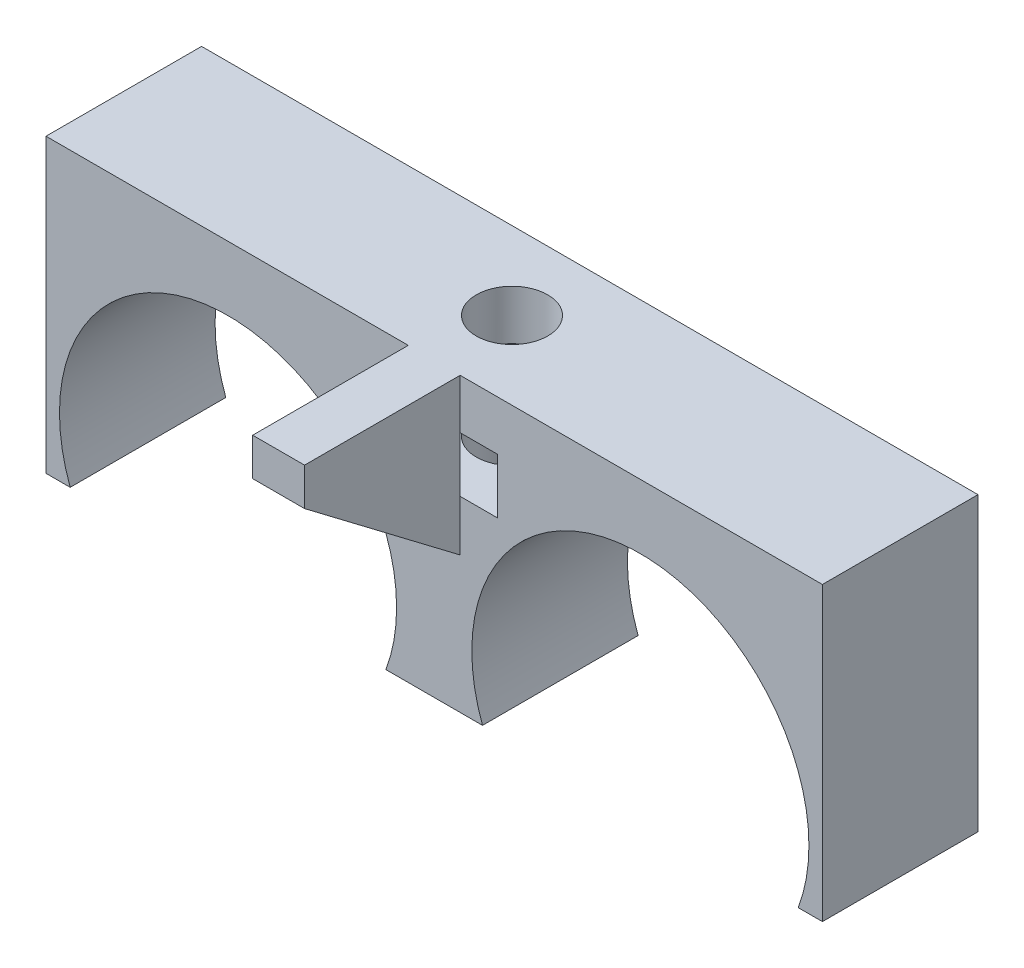
ISO-10303-21;
HEADER;
FILE_DESCRIPTION(('STEP AP214'),'2;1');
FILE_NAME('part.step','',(''),(''),'','','');
FILE_SCHEMA(('AUTOMOTIVE_DESIGN { 1 0 10303 214 1 1 1 1 }'));
ENDSEC;
DATA;
#1=APPLICATION_CONTEXT('core data for automotive mechanical design processes');
#2=APPLICATION_PROTOCOL_DEFINITION('international standard','automotive_design',2000,#1);
#3=PRODUCT_CONTEXT('',#1,'mechanical');
#4=PRODUCT('Part','Part','',(#3));
#5=PRODUCT_RELATED_PRODUCT_CATEGORY('part','',(#4));
#6=PRODUCT_DEFINITION_FORMATION('','',#4);
#7=PRODUCT_DEFINITION_CONTEXT('part definition',#1,'design');
#8=PRODUCT_DEFINITION('design','',#6,#7);
#9=PRODUCT_DEFINITION_SHAPE('','',#8);
#10=(LENGTH_UNIT() NAMED_UNIT(*) SI_UNIT(.MILLI.,.METRE.));
#11=(NAMED_UNIT(*) PLANE_ANGLE_UNIT() SI_UNIT($,.RADIAN.));
#12=(NAMED_UNIT(*) SI_UNIT($,.STERADIAN.) SOLID_ANGLE_UNIT());
#13=UNCERTAINTY_MEASURE_WITH_UNIT(LENGTH_MEASURE(1.E-05),#10,'distance_accuracy_value','');
#14=(GEOMETRIC_REPRESENTATION_CONTEXT(3) GLOBAL_UNCERTAINTY_ASSIGNED_CONTEXT((#13)) GLOBAL_UNIT_ASSIGNED_CONTEXT((#10,
#11,#12)) REPRESENTATION_CONTEXT('',''));
#15=CARTESIAN_POINT('',(0.,0.,0.));
#16=DIRECTION('',(0.,0.,1.));
#17=DIRECTION('',(1.,0.,0.));
#18=AXIS2_PLACEMENT_3D('',#15,#16,#17);
#19=CARTESIAN_POINT('',(-7.52021428571429,21.082,15.24));
#20=DIRECTION('',(1.,0.,0.));
#21=DIRECTION('',(0.,1.,0.));
#22=AXIS2_PLACEMENT_3D('',#19,#20,#21);
#23=PLANE('',#22);
#24=DIRECTION('',(0.,-0.604105826372703,-0.796904103730526));
#25=VECTOR('',#24,1.);
#26=CARTESIAN_POINT('',(-7.52021428571429,19.9112499532501,16.1275056875186));
#27=LINE('',#26,#25);
#28=CARTESIAN_POINT('',(-7.52021428571429,19.2384621557484,15.24));
#29=VERTEX_POINT('',#28);
#30=CARTESIAN_POINT('',(-7.52021428571429,13.462,7.62));
#31=VERTEX_POINT('',#30);
#32=EDGE_CURVE('E181',#29,#31,#27,.T.);
#33=ORIENTED_EDGE('',*,*,#32,.F.);
#34=DIRECTION('',(0.,-1.,0.));
#35=VECTOR('',#34,1.);
#36=CARTESIAN_POINT('',(-7.52021428571429,21.082,15.24));
#37=LINE('',#36,#35);
#38=CARTESIAN_POINT('',(-7.52021428571429,21.082,15.24));
#39=VERTEX_POINT('',#38);
#40=EDGE_CURVE('E202',#39,#29,#37,.T.);
#41=ORIENTED_EDGE('',*,*,#40,.F.);
#42=DIRECTION('',(0.,0.,-1.));
#43=VECTOR('',#42,1.);
#44=CARTESIAN_POINT('',(-7.52021428571429,21.082,15.24));
#45=LINE('',#44,#43);
#46=CARTESIAN_POINT('',(-7.52021428571429,21.082,7.62));
#47=VERTEX_POINT('',#46);
#48=EDGE_CURVE('E232',#39,#47,#45,.T.);
#49=ORIENTED_EDGE('',*,*,#48,.T.);
#50=DIRECTION('',(0.,-1.,0.));
#51=VECTOR('',#50,1.);
#52=CARTESIAN_POINT('',(-7.52021428571429,21.082,7.62));
#53=LINE('',#52,#51);
#54=CARTESIAN_POINT('',(-7.52021428571429,18.6482930460681,7.62));
#55=VERTEX_POINT('',#54);
#56=EDGE_CURVE('E76',#47,#55,#53,.T.);
#57=ORIENTED_EDGE('',*,*,#56,.T.);
#58=CARTESIAN_POINT('',(-7.52021428571429,15.9482931120681,7.62));
#59=VERTEX_POINT('',#58);
#60=EDGE_CURVE('E216',#55,#59,#53,.T.);
#61=ORIENTED_EDGE('',*,*,#60,.T.);
#62=EDGE_CURVE('E211',#59,#31,#53,.T.);
#63=ORIENTED_EDGE('',*,*,#62,.T.);
#64=EDGE_LOOP('',(#33,#41,#49,#57,#61,#63));
#65=FACE_BOUND('',#64,.T.);
#66=ADVANCED_FACE('F53',(#65),#23,.F.);
#67=CARTESIAN_POINT('',(-4.98021428571429,21.082,15.24));
#68=DIRECTION('',(-1.,0.,0.));
#69=DIRECTION('',(0.,-1.,0.));
#70=AXIS2_PLACEMENT_3D('',#67,#68,#69);
#71=PLANE('',#70);
#72=DIRECTION('',(0.,-0.604105826372703,-0.796904103730526));
#73=VECTOR('',#72,1.);
#74=CARTESIAN_POINT('',(-4.98021428571429,4.88074807821952,-3.69992868314658));
#75=LINE('',#74,#73);
#76=CARTESIAN_POINT('',(-4.98021428571429,19.2384621557484,15.24));
#77=VERTEX_POINT('',#76);
#78=CARTESIAN_POINT('',(-4.98021428571429,13.462,7.62));
#79=VERTEX_POINT('',#78);
#80=EDGE_CURVE('E69',#77,#79,#75,.T.);
#81=ORIENTED_EDGE('',*,*,#80,.T.);
#82=DIRECTION('',(0.,1.,0.));
#83=VECTOR('',#82,1.);
#84=CARTESIAN_POINT('',(-4.98021428571429,21.082,7.62));
#85=LINE('',#84,#83);
#86=CARTESIAN_POINT('',(-4.98021428571429,15.9482931120681,7.62));
#87=VERTEX_POINT('',#86);
#88=EDGE_CURVE('E192',#79,#87,#85,.T.);
#89=ORIENTED_EDGE('',*,*,#88,.T.);
#90=CARTESIAN_POINT('',(-4.98021428571429,18.6482930460681,7.62));
#91=VERTEX_POINT('',#90);
#92=EDGE_CURVE('E185',#87,#91,#85,.T.);
#93=ORIENTED_EDGE('',*,*,#92,.T.);
#94=CARTESIAN_POINT('',(-4.98021428571429,21.082,7.62));
#95=VERTEX_POINT('',#94);
#96=EDGE_CURVE('E62',#91,#95,#85,.T.);
#97=ORIENTED_EDGE('',*,*,#96,.T.);
#98=DIRECTION('',(0.,0.,-1.));
#99=VECTOR('',#98,1.);
#100=CARTESIAN_POINT('',(-4.98021428571429,21.082,15.24));
#101=LINE('',#100,#99);
#102=CARTESIAN_POINT('',(-4.98021428571429,21.082,15.24));
#103=VERTEX_POINT('',#102);
#104=EDGE_CURVE('E238',#103,#95,#101,.T.);
#105=ORIENTED_EDGE('',*,*,#104,.F.);
#106=DIRECTION('',(0.,1.,0.));
#107=VECTOR('',#106,1.);
#108=CARTESIAN_POINT('',(-4.98021428571429,21.082,15.24));
#109=LINE('',#108,#107);
#110=EDGE_CURVE('E194',#77,#103,#109,.T.);
#111=ORIENTED_EDGE('',*,*,#110,.F.);
#112=EDGE_LOOP('',(#81,#89,#93,#97,#105,#111));
#113=FACE_BOUND('',#112,.T.);
#114=ADVANCED_FACE('F190',(#113),#71,.F.);
#115=CARTESIAN_POINT('',(0.,0.,15.24));
#116=DIRECTION('',(0.,0.,1.));
#117=DIRECTION('',(1.,0.,0.));
#118=AXIS2_PLACEMENT_3D('',#115,#116,#117);
#119=PLANE('',#118);
#120=ORIENTED_EDGE('',*,*,#40,.T.);
#121=DIRECTION('',(1.,0.,0.));
#122=VECTOR('',#121,1.);
#123=CARTESIAN_POINT('',(0.,19.2384621557484,15.24));
#124=LINE('',#123,#122);
#125=EDGE_CURVE('E13',#29,#77,#124,.T.);
#126=ORIENTED_EDGE('',*,*,#125,.T.);
#127=ORIENTED_EDGE('',*,*,#110,.T.);
#128=DIRECTION('',(-1.,0.,0.));
#129=VECTOR('',#128,1.);
#130=CARTESIAN_POINT('',(-7.52021428571429,21.082,15.24));
#131=LINE('',#130,#129);
#132=EDGE_CURVE('E230',#103,#39,#131,.T.);
#133=ORIENTED_EDGE('',*,*,#132,.T.);
#134=EDGE_LOOP('',(#120,#126,#127,#133));
#135=FACE_BOUND('',#134,.T.);
#136=ADVANCED_FACE('F416',(#135),#119,.T.);
#137=CARTESIAN_POINT('',(-6.25021428571429,21.082,3.81));
#138=DIRECTION('',(0.,-1.,0.));
#139=DIRECTION('',(0.,0.,-1.));
#140=AXIS2_PLACEMENT_3D('',#137,#138,#139);
#141=CYLINDRICAL_SURFACE('',#140,1.75);
#142=CARTESIAN_POINT('',(-6.25021428571429,18.6482930460681,3.81));
#143=DIRECTION('',(0.,-1.,0.));
#144=DIRECTION('',(0.,0.,-1.));
#145=AXIS2_PLACEMENT_3D('',#142,#143,#144);
#146=CIRCLE('',#145,1.75);
#147=CARTESIAN_POINT('',(-6.25021428571429,18.6482930460681,2.06));
#148=VERTEX_POINT('',#147);
#149=EDGE_CURVE('E300',#148,#148,#146,.T.);
#150=ORIENTED_EDGE('',*,*,#149,.T.);
#151=EDGE_LOOP('',(#150));
#152=FACE_BOUND('',#151,.T.);
#153=CARTESIAN_POINT('',(-6.25021428571429,21.082,3.81));
#154=DIRECTION('',(0.,1.,0.));
#155=DIRECTION('',(0.,0.,1.));
#156=AXIS2_PLACEMENT_3D('',#153,#154,#155);
#157=CIRCLE('',#156,1.75);
#158=CARTESIAN_POINT('',(-6.25021428571429,21.082,5.56));
#159=VERTEX_POINT('',#158);
#160=EDGE_CURVE('E241',#159,#159,#157,.T.);
#161=ORIENTED_EDGE('',*,*,#160,.T.);
#162=EDGE_LOOP('',(#161));
#163=FACE_BOUND('',#162,.T.);
#164=ADVANCED_FACE('F398',(#152,#163),#141,.F.);
#165=CARTESIAN_POINT('',(0.,6.7818,7.62));
#166=DIRECTION('',(0.,-1.,0.));
#167=DIRECTION('',(0.,0.,-1.));
#168=AXIS2_PLACEMENT_3D('',#165,#166,#167);
#169=PLANE('',#168);
#170=DIRECTION('',(-1.,0.,0.));
#171=VECTOR('',#170,1.);
#172=CARTESIAN_POINT('',(0.,6.7818,0.));
#173=LINE('',#172,#171);
#174=CARTESIAN_POINT('',(12.7616857142857,6.7818,0.));
#175=VERTEX_POINT('',#174);
#176=CARTESIAN_POINT('',(11.5767789482262,6.7818,0.));
#177=VERTEX_POINT('',#176);
#178=EDGE_CURVE('E315',#175,#177,#173,.T.);
#179=ORIENTED_EDGE('',*,*,#178,.F.);
#180=DIRECTION('',(0.,0.,-1.));
#181=VECTOR('',#180,1.);
#182=CARTESIAN_POINT('',(12.7616857142857,6.7818,7.62));
#183=LINE('',#182,#181);
#184=CARTESIAN_POINT('',(12.7616857142857,6.7818,7.62));
#185=VERTEX_POINT('',#184);
#186=EDGE_CURVE('E214',#185,#175,#183,.T.);
#187=ORIENTED_EDGE('',*,*,#186,.F.);
#188=DIRECTION('',(-1.,0.,0.));
#189=VECTOR('',#188,1.);
#190=CARTESIAN_POINT('',(0.,6.7818,7.62));
#191=LINE('',#190,#189);
#192=CARTESIAN_POINT('',(11.5767789482262,6.7818,7.62));
#193=VERTEX_POINT('',#192);
#194=EDGE_CURVE('E317',#185,#193,#191,.T.);
#195=ORIENTED_EDGE('',*,*,#194,.T.);
#196=DIRECTION('',(0.,0.,-1.));
#197=VECTOR('',#196,1.);
#198=CARTESIAN_POINT('',(11.5767789482262,6.7818,7.62));
#199=LINE('',#198,#197);
#200=EDGE_CURVE('E344',#193,#177,#199,.T.);
#201=ORIENTED_EDGE('',*,*,#200,.T.);
#202=EDGE_LOOP('',(#179,#187,#195,#201));
#203=FACE_BOUND('',#202,.T.);
#204=ADVANCED_FACE('F55',(#203),#169,.T.);
#205=CARTESIAN_POINT('',(12.7616857142857,0.,7.62));
#206=DIRECTION('',(1.,0.,0.));
#207=DIRECTION('',(0.,0.,-1.));
#208=AXIS2_PLACEMENT_3D('',#205,#206,#207);
#209=PLANE('',#208);
#210=DIRECTION('',(0.,-1.,0.));
#211=VECTOR('',#210,1.);
#212=CARTESIAN_POINT('',(12.7616857142857,0.,0.));
#213=LINE('',#212,#211);
#214=CARTESIAN_POINT('',(12.7616857142857,21.082,0.));
#215=VERTEX_POINT('',#214);
#216=EDGE_CURVE('E348',#215,#175,#213,.T.);
#217=ORIENTED_EDGE('',*,*,#216,.F.);
#218=DIRECTION('',(0.,0.,-1.));
#219=VECTOR('',#218,1.);
#220=CARTESIAN_POINT('',(12.7616857142857,21.082,7.62));
#221=LINE('',#220,#219);
#222=CARTESIAN_POINT('',(12.7616857142857,21.082,7.62));
#223=VERTEX_POINT('',#222);
#224=EDGE_CURVE('E247',#223,#215,#221,.T.);
#225=ORIENTED_EDGE('',*,*,#224,.F.);
#226=DIRECTION('',(0.,-1.,0.));
#227=VECTOR('',#226,1.);
#228=CARTESIAN_POINT('',(12.7616857142857,0.,7.62));
#229=LINE('',#228,#227);
#230=EDGE_CURVE('E321',#223,#185,#229,.T.);
#231=ORIENTED_EDGE('',*,*,#230,.T.);
#232=ORIENTED_EDGE('',*,*,#186,.T.);
#233=EDGE_LOOP('',(#217,#225,#231,#232));
#234=FACE_BOUND('',#233,.T.);
#235=ADVANCED_FACE('F463',(#234),#209,.T.);
#236=CARTESIAN_POINT('',(-25.2621142857143,0.,7.62));
#237=DIRECTION('',(-1.,0.,0.));
#238=DIRECTION('',(0.,0.,1.));
#239=AXIS2_PLACEMENT_3D('',#236,#237,#238);
#240=PLANE('',#239);
#241=DIRECTION('',(0.,1.,0.));
#242=VECTOR('',#241,1.);
#243=CARTESIAN_POINT('',(-25.2621142857143,0.,0.));
#244=LINE('',#243,#242);
#245=CARTESIAN_POINT('',(-25.2621142857143,6.7818,0.));
#246=VERTEX_POINT('',#245);
#247=CARTESIAN_POINT('',(-25.2621142857143,21.082,0.));
#248=VERTEX_POINT('',#247);
#249=EDGE_CURVE('E352',#246,#248,#244,.T.);
#250=ORIENTED_EDGE('',*,*,#249,.F.);
#251=DIRECTION('',(0.,0.,-1.));
#252=VECTOR('',#251,1.);
#253=CARTESIAN_POINT('',(-25.2621142857143,6.7818,7.62));
#254=LINE('',#253,#252);
#255=CARTESIAN_POINT('',(-25.2621142857143,6.7818,7.62));
#256=VERTEX_POINT('',#255);
#257=EDGE_CURVE('E220',#256,#246,#254,.T.);
#258=ORIENTED_EDGE('',*,*,#257,.F.);
#259=DIRECTION('',(0.,1.,0.));
#260=VECTOR('',#259,1.);
#261=CARTESIAN_POINT('',(-25.2621142857143,0.,7.62));
#262=LINE('',#261,#260);
#263=CARTESIAN_POINT('',(-25.2621142857143,21.082,7.62));
#264=VERTEX_POINT('',#263);
#265=EDGE_CURVE('E326',#256,#264,#262,.T.);
#266=ORIENTED_EDGE('',*,*,#265,.T.);
#267=DIRECTION('',(0.,0.,1.));
#268=VECTOR('',#267,1.);
#269=CARTESIAN_POINT('',(-25.2621142857143,21.082,7.62));
#270=LINE('',#269,#268);
#271=EDGE_CURVE('E255',#248,#264,#270,.T.);
#272=ORIENTED_EDGE('',*,*,#271,.F.);
#273=EDGE_LOOP('',(#250,#258,#266,#272));
#274=FACE_BOUND('',#273,.T.);
#275=ADVANCED_FACE('F460',(#274),#240,.T.);
#276=CARTESIAN_POINT('',(0.,6.7818,7.62));
#277=DIRECTION('',(0.,-1.,0.));
#278=DIRECTION('',(0.,0.,-1.));
#279=AXIS2_PLACEMENT_3D('',#276,#277,#278);
#280=PLANE('',#279);
#281=DIRECTION('',(-1.,0.,0.));
#282=VECTOR('',#281,1.);
#283=CARTESIAN_POINT('',(0.,6.7818,0.));
#284=LINE('',#283,#282);
#285=CARTESIAN_POINT('',(-24.0772075196548,6.7818,0.));
#286=VERTEX_POINT('',#285);
#287=EDGE_CURVE('E355',#286,#246,#284,.T.);
#288=ORIENTED_EDGE('',*,*,#287,.F.);
#289=DIRECTION('',(0.,0.,-1.));
#290=VECTOR('',#289,1.);
#291=CARTESIAN_POINT('',(-24.0772075196548,6.7818,7.62));
#292=LINE('',#291,#290);
#293=CARTESIAN_POINT('',(-24.0772075196548,6.7818,7.62));
#294=VERTEX_POINT('',#293);
#295=EDGE_CURVE('E378',#294,#286,#292,.T.);
#296=ORIENTED_EDGE('',*,*,#295,.F.);
#297=DIRECTION('',(-1.,0.,0.));
#298=VECTOR('',#297,1.);
#299=CARTESIAN_POINT('',(0.,6.7818,7.62));
#300=LINE('',#299,#298);
#301=EDGE_CURVE('E329',#294,#256,#300,.T.);
#302=ORIENTED_EDGE('',*,*,#301,.T.);
#303=ORIENTED_EDGE('',*,*,#257,.T.);
#304=EDGE_LOOP('',(#288,#296,#302,#303));
#305=FACE_BOUND('',#304,.T.);
#306=ADVANCED_FACE('F456',(#305),#280,.T.);
#307=CARTESIAN_POINT('',(-16.3467142857143,9.6774,7.62));
#308=DIRECTION('',(0.,0.,-1.));
#309=DIRECTION('',(-1.,0.,0.));
#310=AXIS2_PLACEMENT_3D('',#307,#308,#309);
#311=CYLINDRICAL_SURFACE('',#310,8.255);
#312=CARTESIAN_POINT('',(-16.3467142857143,9.6774,0.));
#313=DIRECTION('',(0.,0.,1.));
#314=DIRECTION('',(1.,0.,0.));
#315=AXIS2_PLACEMENT_3D('',#312,#313,#314);
#316=CIRCLE('',#315,8.255);
#317=CARTESIAN_POINT('',(-8.61622105177378,6.7818,0.));
#318=VERTEX_POINT('',#317);
#319=EDGE_CURVE('E359',#318,#286,#316,.T.);
#320=ORIENTED_EDGE('',*,*,#319,.F.);
#321=DIRECTION('',(0.,0.,-1.));
#322=VECTOR('',#321,1.);
#323=CARTESIAN_POINT('',(-8.61622105177378,6.7818,7.62));
#324=LINE('',#323,#322);
#325=CARTESIAN_POINT('',(-8.61622105177378,6.7818,7.62));
#326=VERTEX_POINT('',#325);
#327=EDGE_CURVE('E375',#326,#318,#324,.T.);
#328=ORIENTED_EDGE('',*,*,#327,.F.);
#329=CARTESIAN_POINT('',(-16.3467142857143,9.6774,7.62));
#330=DIRECTION('',(0.,0.,1.));
#331=DIRECTION('',(1.,0.,0.));
#332=AXIS2_PLACEMENT_3D('',#329,#330,#331);
#333=CIRCLE('',#332,8.255);
#334=EDGE_CURVE('E333',#326,#294,#333,.T.);
#335=ORIENTED_EDGE('',*,*,#334,.T.);
#336=ORIENTED_EDGE('',*,*,#295,.T.);
#337=EDGE_LOOP('',(#320,#328,#335,#336));
#338=FACE_BOUND('',#337,.T.);
#339=ADVANCED_FACE('F452',(#338),#311,.F.);
#340=CARTESIAN_POINT('',(0.,6.7818,7.62));
#341=DIRECTION('',(0.,-1.,0.));
#342=DIRECTION('',(0.,0.,-1.));
#343=AXIS2_PLACEMENT_3D('',#340,#341,#342);
#344=PLANE('',#343);
#345=DIRECTION('',(-1.,0.,0.));
#346=VECTOR('',#345,1.);
#347=CARTESIAN_POINT('',(0.,6.7818,0.));
#348=LINE('',#347,#346);
#349=CARTESIAN_POINT('',(-3.88420751965479,6.7818,0.));
#350=VERTEX_POINT('',#349);
#351=EDGE_CURVE('E363',#350,#318,#348,.T.);
#352=ORIENTED_EDGE('',*,*,#351,.F.);
#353=DIRECTION('',(0.,0.,-1.));
#354=VECTOR('',#353,1.);
#355=CARTESIAN_POINT('',(-3.88420751965479,6.7818,7.62));
#356=LINE('',#355,#354);
#357=CARTESIAN_POINT('',(-3.88420751965479,6.7818,7.62));
#358=VERTEX_POINT('',#357);
#359=EDGE_CURVE('E372',#358,#350,#356,.T.);
#360=ORIENTED_EDGE('',*,*,#359,.F.);
#361=DIRECTION('',(-1.,0.,0.));
#362=VECTOR('',#361,1.);
#363=CARTESIAN_POINT('',(0.,6.7818,7.62));
#364=LINE('',#363,#362);
#365=EDGE_CURVE('E336',#358,#326,#364,.T.);
#366=ORIENTED_EDGE('',*,*,#365,.T.);
#367=ORIENTED_EDGE('',*,*,#327,.T.);
#368=EDGE_LOOP('',(#352,#360,#366,#367));
#369=FACE_BOUND('',#368,.T.);
#370=ADVANCED_FACE('F448',(#369),#344,.T.);
#371=CARTESIAN_POINT('',(3.84628571428571,9.6774,7.62));
#372=DIRECTION('',(0.,0.,-1.));
#373=DIRECTION('',(-1.,0.,0.));
#374=AXIS2_PLACEMENT_3D('',#371,#372,#373);
#375=CYLINDRICAL_SURFACE('',#374,8.255);
#376=CARTESIAN_POINT('',(3.84628571428571,9.6774,0.));
#377=DIRECTION('',(0.,0.,1.));
#378=DIRECTION('',(1.,0.,0.));
#379=AXIS2_PLACEMENT_3D('',#376,#377,#378);
#380=CIRCLE('',#379,8.255);
#381=EDGE_CURVE('E322',#177,#350,#380,.T.);
#382=ORIENTED_EDGE('',*,*,#381,.F.);
#383=ORIENTED_EDGE('',*,*,#200,.F.);
#384=CARTESIAN_POINT('',(3.84628571428571,9.6774,7.62));
#385=DIRECTION('',(0.,0.,1.));
#386=DIRECTION('',(1.,0.,0.));
#387=AXIS2_PLACEMENT_3D('',#384,#385,#386);
#388=CIRCLE('',#387,8.255);
#389=EDGE_CURVE('E340',#193,#358,#388,.T.);
#390=ORIENTED_EDGE('',*,*,#389,.T.);
#391=ORIENTED_EDGE('',*,*,#359,.T.);
#392=EDGE_LOOP('',(#382,#383,#390,#391));
#393=FACE_BOUND('',#392,.T.);
#394=ADVANCED_FACE('F441',(#393),#375,.F.);
#395=CARTESIAN_POINT('',(0.,0.,7.62));
#396=DIRECTION('',(0.,0.,1.));
#397=DIRECTION('',(1.,0.,0.));
#398=AXIS2_PLACEMENT_3D('',#395,#396,#397);
#399=PLANE('',#398);
#400=DIRECTION('',(1.,0.,0.));
#401=VECTOR('',#400,1.);
#402=CARTESIAN_POINT('',(-7.52021428571429,13.462,7.62));
#403=LINE('',#402,#401);
#404=EDGE_CURVE('E178',#31,#79,#403,.T.);
#405=ORIENTED_EDGE('',*,*,#404,.F.);
#406=ORIENTED_EDGE('',*,*,#62,.F.);
#407=DIRECTION('',(1.,0.,0.));
#408=VECTOR('',#407,1.);
#409=CARTESIAN_POINT('',(0.,15.9482931120681,7.62));
#410=LINE('',#409,#408);
#411=CARTESIAN_POINT('',(-9.35021428571399,15.9482931120681,7.62));
#412=VERTEX_POINT('',#411);
#413=EDGE_CURVE('E280',#412,#59,#410,.T.);
#414=ORIENTED_EDGE('',*,*,#413,.F.);
#415=DIRECTION('',(0.,1.,0.));
#416=VECTOR('',#415,1.);
#417=CARTESIAN_POINT('',(-9.35021428571399,0.,7.62));
#418=LINE('',#417,#416);
#419=CARTESIAN_POINT('',(-9.35021428571399,18.6482930460681,7.62));
#420=VERTEX_POINT('',#419);
#421=EDGE_CURVE('E268',#412,#420,#418,.T.);
#422=ORIENTED_EDGE('',*,*,#421,.T.);
#423=DIRECTION('',(1.,0.,0.));
#424=VECTOR('',#423,1.);
#425=CARTESIAN_POINT('',(0.,18.6482930460681,7.62));
#426=LINE('',#425,#424);
#427=EDGE_CURVE('E290',#420,#55,#426,.T.);
#428=ORIENTED_EDGE('',*,*,#427,.T.);
#429=ORIENTED_EDGE('',*,*,#56,.F.);
#430=DIRECTION('',(1.,0.,0.));
#431=VECTOR('',#430,1.);
#432=CARTESIAN_POINT('',(12.7616857142857,21.082,7.62));
#433=LINE('',#432,#431);
#434=EDGE_CURVE('E260',#264,#47,#433,.T.);
#435=ORIENTED_EDGE('',*,*,#434,.F.);
#436=ORIENTED_EDGE('',*,*,#265,.F.);
#437=ORIENTED_EDGE('',*,*,#301,.F.);
#438=ORIENTED_EDGE('',*,*,#334,.F.);
#439=ORIENTED_EDGE('',*,*,#365,.F.);
#440=ORIENTED_EDGE('',*,*,#389,.F.);
#441=ORIENTED_EDGE('',*,*,#194,.F.);
#442=ORIENTED_EDGE('',*,*,#230,.F.);
#443=EDGE_CURVE('E259',#95,#223,#433,.T.);
#444=ORIENTED_EDGE('',*,*,#443,.F.);
#445=ORIENTED_EDGE('',*,*,#96,.F.);
#446=CARTESIAN_POINT('',(-3.150214285714,18.6482930460681,7.62));
#447=VERTEX_POINT('',#446);
#448=EDGE_CURVE('E289',#91,#447,#426,.T.);
#449=ORIENTED_EDGE('',*,*,#448,.T.);
#450=DIRECTION('',(0.,1.,0.));
#451=VECTOR('',#450,1.);
#452=CARTESIAN_POINT('',(-3.150214285714,0.,7.62));
#453=LINE('',#452,#451);
#454=CARTESIAN_POINT('',(-3.150214285714,15.9482931120681,7.62));
#455=VERTEX_POINT('',#454);
#456=EDGE_CURVE('E284',#455,#447,#453,.T.);
#457=ORIENTED_EDGE('',*,*,#456,.F.);
#458=EDGE_CURVE('E199',#87,#455,#410,.T.);
#459=ORIENTED_EDGE('',*,*,#458,.F.);
#460=ORIENTED_EDGE('',*,*,#88,.F.);
#461=EDGE_LOOP('',(#405,#406,#414,#422,#428,#429,#435,#436,#437,#438,#439,#440,#441,#442,#444,
#445,#449,#457,#459,#460));
#462=FACE_BOUND('',#461,.T.);
#463=ADVANCED_FACE('F197',(#462),#399,.T.);
#464=CARTESIAN_POINT('',(0.,0.,0.));
#465=DIRECTION('',(0.,0.,1.));
#466=DIRECTION('',(1.,0.,0.));
#467=AXIS2_PLACEMENT_3D('',#464,#465,#466);
#468=PLANE('',#467);
#469=DIRECTION('',(0.,1.,0.));
#470=VECTOR('',#469,1.);
#471=CARTESIAN_POINT('',(-9.35021428571399,0.,0.));
#472=LINE('',#471,#470);
#473=CARTESIAN_POINT('',(-9.35021428571399,15.9482931120681,0.));
#474=VERTEX_POINT('',#473);
#475=CARTESIAN_POINT('',(-9.35021428571399,18.6482930460681,0.));
#476=VERTEX_POINT('',#475);
#477=EDGE_CURVE('E276',#474,#476,#472,.T.);
#478=ORIENTED_EDGE('',*,*,#477,.F.);
#479=DIRECTION('',(1.,0.,0.));
#480=VECTOR('',#479,1.);
#481=CARTESIAN_POINT('',(0.,15.9482931120681,0.));
#482=LINE('',#481,#480);
#483=CARTESIAN_POINT('',(-3.150214285714,15.9482931120681,0.));
#484=VERTEX_POINT('',#483);
#485=EDGE_CURVE('E263',#474,#484,#482,.T.);
#486=ORIENTED_EDGE('',*,*,#485,.T.);
#487=DIRECTION('',(0.,1.,0.));
#488=VECTOR('',#487,1.);
#489=CARTESIAN_POINT('',(-3.150214285714,0.,0.));
#490=LINE('',#489,#488);
#491=CARTESIAN_POINT('',(-3.150214285714,18.6482930460681,0.));
#492=VERTEX_POINT('',#491);
#493=EDGE_CURVE('E267',#484,#492,#490,.T.);
#494=ORIENTED_EDGE('',*,*,#493,.T.);
#495=DIRECTION('',(1.,0.,0.));
#496=VECTOR('',#495,1.);
#497=CARTESIAN_POINT('',(0.,18.6482930460681,0.));
#498=LINE('',#497,#496);
#499=EDGE_CURVE('E272',#476,#492,#498,.T.);
#500=ORIENTED_EDGE('',*,*,#499,.F.);
#501=EDGE_LOOP('',(#478,#486,#494,#500));
#502=FACE_BOUND('',#501,.T.);
#503=ORIENTED_EDGE('',*,*,#178,.T.);
#504=ORIENTED_EDGE('',*,*,#381,.T.);
#505=ORIENTED_EDGE('',*,*,#351,.T.);
#506=ORIENTED_EDGE('',*,*,#319,.T.);
#507=ORIENTED_EDGE('',*,*,#287,.T.);
#508=ORIENTED_EDGE('',*,*,#249,.T.);
#509=DIRECTION('',(-1.,0.,0.));
#510=VECTOR('',#509,1.);
#511=CARTESIAN_POINT('',(12.7616857142857,21.082,0.));
#512=LINE('',#511,#510);
#513=EDGE_CURVE('E251',#215,#248,#512,.T.);
#514=ORIENTED_EDGE('',*,*,#513,.F.);
#515=ORIENTED_EDGE('',*,*,#216,.T.);
#516=EDGE_LOOP('',(#503,#504,#505,#506,#507,#508,#514,#515));
#517=FACE_BOUND('',#516,.T.);
#518=ADVANCED_FACE('F431',(#502,#517),#468,.F.);
#519=CARTESIAN_POINT('',(0.,15.9482931120681,0.));
#520=DIRECTION('',(0.,-1.,0.));
#521=DIRECTION('',(0.,0.,-1.));
#522=AXIS2_PLACEMENT_3D('',#519,#520,#521);
#523=PLANE('',#522);
#524=CARTESIAN_POINT('',(-6.25021428571429,15.9482931120681,3.81));
#525=DIRECTION('',(0.,-1.,0.));
#526=DIRECTION('',(0.,0.,-1.));
#527=AXIS2_PLACEMENT_3D('',#524,#525,#526);
#528=CIRCLE('',#527,1.75);
#529=CARTESIAN_POINT('',(-6.25021428571429,15.9482931120681,2.06));
#530=VERTEX_POINT('',#529);
#531=EDGE_CURVE('E316',#530,#530,#528,.T.);
#532=ORIENTED_EDGE('',*,*,#531,.T.);
#533=EDGE_LOOP('',(#532));
#534=FACE_BOUND('',#533,.T.);
#535=ORIENTED_EDGE('',*,*,#413,.T.);
#536=EDGE_CURVE('E285',#59,#87,#410,.T.);
#537=ORIENTED_EDGE('',*,*,#536,.T.);
#538=ORIENTED_EDGE('',*,*,#458,.T.);
#539=DIRECTION('',(0.,0.,1.));
#540=VECTOR('',#539,1.);
#541=CARTESIAN_POINT('',(-3.150214285714,15.9482931120681,0.));
#542=LINE('',#541,#540);
#543=EDGE_CURVE('E279',#484,#455,#542,.T.);
#544=ORIENTED_EDGE('',*,*,#543,.F.);
#545=ORIENTED_EDGE('',*,*,#485,.F.);
#546=DIRECTION('',(0.,0.,1.));
#547=VECTOR('',#546,1.);
#548=CARTESIAN_POINT('',(-9.35021428571399,15.9482931120681,0.));
#549=LINE('',#548,#547);
#550=EDGE_CURVE('E297',#474,#412,#549,.T.);
#551=ORIENTED_EDGE('',*,*,#550,.T.);
#552=EDGE_LOOP('',(#535,#537,#538,#544,#545,#551));
#553=FACE_BOUND('',#552,.T.);
#554=ADVANCED_FACE('F389',(#534,#553),#523,.F.);
#555=CARTESIAN_POINT('',(-9.35021428571399,0.,0.));
#556=DIRECTION('',(1.,0.,0.));
#557=DIRECTION('',(0.,0.,-1.));
#558=AXIS2_PLACEMENT_3D('',#555,#556,#557);
#559=PLANE('',#558);
#560=ORIENTED_EDGE('',*,*,#421,.F.);
#561=ORIENTED_EDGE('',*,*,#550,.F.);
#562=ORIENTED_EDGE('',*,*,#477,.T.);
#563=DIRECTION('',(0.,0.,1.));
#564=VECTOR('',#563,1.);
#565=CARTESIAN_POINT('',(-9.35021428571399,18.6482930460681,0.));
#566=LINE('',#565,#564);
#567=EDGE_CURVE('E301',#476,#420,#566,.T.);
#568=ORIENTED_EDGE('',*,*,#567,.T.);
#569=EDGE_LOOP('',(#560,#561,#562,#568));
#570=FACE_BOUND('',#569,.T.);
#571=ADVANCED_FACE('F424',(#570),#559,.T.);
#572=CARTESIAN_POINT('',(0.,18.6482930460681,0.));
#573=DIRECTION('',(0.,-1.,0.));
#574=DIRECTION('',(0.,0.,-1.));
#575=AXIS2_PLACEMENT_3D('',#572,#573,#574);
#576=PLANE('',#575);
#577=ORIENTED_EDGE('',*,*,#149,.F.);
#578=EDGE_LOOP('',(#577));
#579=FACE_BOUND('',#578,.T.);
#580=ORIENTED_EDGE('',*,*,#427,.F.);
#581=ORIENTED_EDGE('',*,*,#567,.F.);
#582=ORIENTED_EDGE('',*,*,#499,.T.);
#583=DIRECTION('',(0.,0.,1.));
#584=VECTOR('',#583,1.);
#585=CARTESIAN_POINT('',(-3.150214285714,18.6482930460681,0.));
#586=LINE('',#585,#584);
#587=EDGE_CURVE('E304',#492,#447,#586,.T.);
#588=ORIENTED_EDGE('',*,*,#587,.T.);
#589=ORIENTED_EDGE('',*,*,#448,.F.);
#590=EDGE_CURVE('E293',#55,#91,#426,.T.);
#591=ORIENTED_EDGE('',*,*,#590,.F.);
#592=EDGE_LOOP('',(#580,#581,#582,#588,#589,#591));
#593=FACE_BOUND('',#592,.T.);
#594=ADVANCED_FACE('F407',(#579,#593),#576,.T.);
#595=CARTESIAN_POINT('',(-3.150214285714,0.,0.));
#596=DIRECTION('',(1.,0.,0.));
#597=DIRECTION('',(0.,1.,0.));
#598=AXIS2_PLACEMENT_3D('',#595,#596,#597);
#599=PLANE('',#598);
#600=ORIENTED_EDGE('',*,*,#456,.T.);
#601=ORIENTED_EDGE('',*,*,#587,.F.);
#602=ORIENTED_EDGE('',*,*,#493,.F.);
#603=ORIENTED_EDGE('',*,*,#543,.T.);
#604=EDGE_LOOP('',(#600,#601,#602,#603));
#605=FACE_BOUND('',#604,.T.);
#606=ADVANCED_FACE('F402',(#605),#599,.F.);
#607=CARTESIAN_POINT('',(0.,11.939,0.));
#608=DIRECTION('',(0.,1.,0.));
#609=DIRECTION('',(0.,0.,1.));
#610=AXIS2_PLACEMENT_3D('',#607,#608,#609);
#611=PLANE('',#610);
#612=CARTESIAN_POINT('',(-6.25021428571429,11.939,3.81));
#613=DIRECTION('',(0.,1.,0.));
#614=DIRECTION('',(0.,0.,1.));
#615=AXIS2_PLACEMENT_3D('',#612,#613,#614);
#616=CIRCLE('',#615,1.75);
#617=CARTESIAN_POINT('',(-6.25021428571429,11.939,5.56));
#618=VERTEX_POINT('',#617);
#619=EDGE_CURVE('E311',#618,#618,#616,.T.);
#620=ORIENTED_EDGE('',*,*,#619,.T.);
#621=EDGE_LOOP('',(#620));
#622=FACE_BOUND('',#621,.T.);
#623=ADVANCED_FACE('F396',(#622),#611,.T.);
#624=ORIENTED_EDGE('',*,*,#531,.F.);
#625=EDGE_LOOP('',(#624));
#626=FACE_BOUND('',#625,.T.);
#627=ORIENTED_EDGE('',*,*,#619,.F.);
#628=EDGE_LOOP('',(#627));
#629=FACE_BOUND('',#628,.T.);
#630=ADVANCED_FACE('F392',(#626,#629),#141,.F.);
#631=CARTESIAN_POINT('',(0.,21.082,0.));
#632=DIRECTION('',(0.,1.,0.));
#633=DIRECTION('',(0.,0.,1.));
#634=AXIS2_PLACEMENT_3D('',#631,#632,#633);
#635=PLANE('',#634);
#636=ORIENTED_EDGE('',*,*,#224,.T.);
#637=ORIENTED_EDGE('',*,*,#513,.T.);
#638=ORIENTED_EDGE('',*,*,#271,.T.);
#639=ORIENTED_EDGE('',*,*,#434,.T.);
#640=ORIENTED_EDGE('',*,*,#48,.F.);
#641=ORIENTED_EDGE('',*,*,#132,.F.);
#642=ORIENTED_EDGE('',*,*,#104,.T.);
#643=ORIENTED_EDGE('',*,*,#443,.T.);
#644=EDGE_LOOP('',(#636,#637,#638,#639,#640,#641,#642,#643));
#645=FACE_BOUND('',#644,.T.);
#646=ORIENTED_EDGE('',*,*,#160,.F.);
#647=EDGE_LOOP('',(#646));
#648=FACE_BOUND('',#647,.T.);
#649=ADVANCED_FACE('F395',(#645,#648),#635,.T.);
#650=CARTESIAN_POINT('',(0.,0.,7.62));
#651=DIRECTION('',(0.,0.,1.));
#652=DIRECTION('',(1.,0.,0.));
#653=AXIS2_PLACEMENT_3D('',#650,#651,#652);
#654=PLANE('',#653);
#655=ORIENTED_EDGE('',*,*,#536,.F.);
#656=ORIENTED_EDGE('',*,*,#60,.F.);
#657=ORIENTED_EDGE('',*,*,#590,.T.);
#658=ORIENTED_EDGE('',*,*,#92,.F.);
#659=EDGE_LOOP('',(#655,#656,#657,#658));
#660=FACE_BOUND('',#659,.T.);
#661=ADVANCED_FACE('F422',(#660),#654,.F.);
#662=CARTESIAN_POINT('',(-12.6002142857143,4.88074807821952,-3.69992868314658));
#663=DIRECTION('',(0.,-0.796904103730526,0.604105826372703));
#664=DIRECTION('',(0.,-0.604105826372703,-0.796904103730526));
#665=AXIS2_PLACEMENT_3D('',#662,#663,#664);
#666=PLANE('',#665);
#667=ORIENTED_EDGE('',*,*,#32,.T.);
#668=ORIENTED_EDGE('',*,*,#404,.T.);
#669=ORIENTED_EDGE('',*,*,#80,.F.);
#670=ORIENTED_EDGE('',*,*,#125,.F.);
#671=EDGE_LOOP('',(#667,#668,#669,#670));
#672=FACE_BOUND('',#671,.T.);
#673=ADVANCED_FACE('F179',(#672),#666,.T.);
#674=CLOSED_SHELL('',(#66,#114,#136,#164,#204,#235,#275,#306,#339,#370,#394,#463,#518,#554,#571,
#594,#606,#623,#630,#649,#661,#673));
#675=MANIFOLD_SOLID_BREP('B2',#674);
#676=ADVANCED_BREP_SHAPE_REPRESENTATION('',(#18,#675),#14);
#677=SHAPE_DEFINITION_REPRESENTATION(#9,#676);
ENDSEC;
END-ISO-10303-21;
